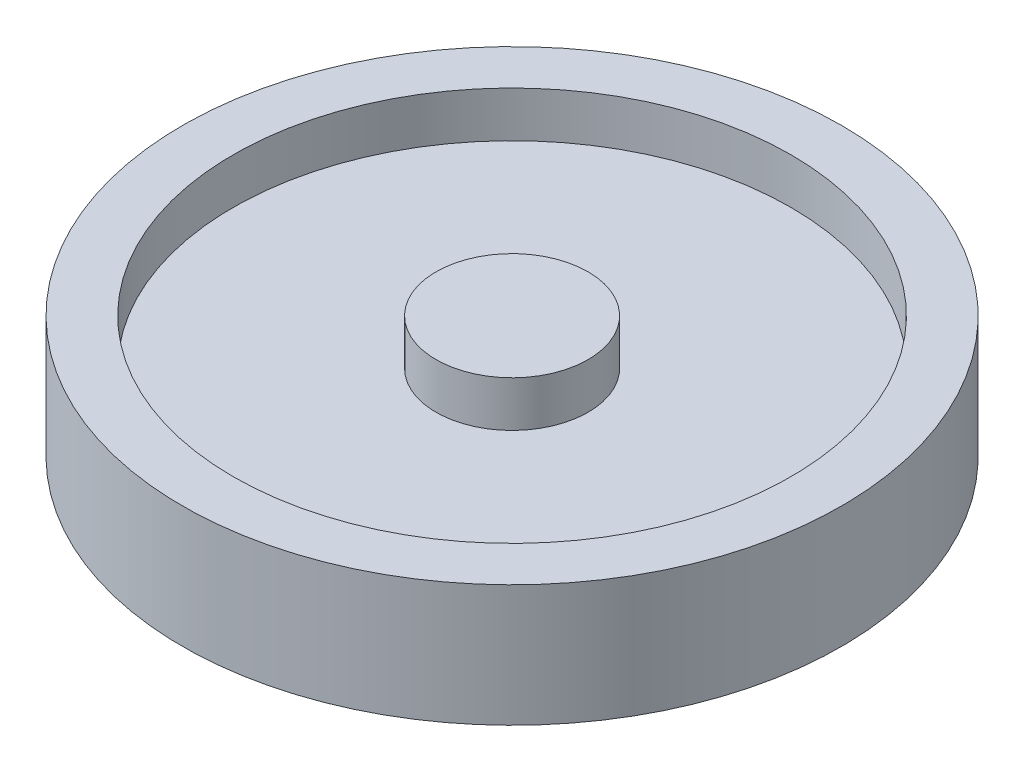
ISO-10303-21;
HEADER;
FILE_DESCRIPTION(('STEP AP214'),'2;1');
FILE_NAME('part.step','',(''),(''),'','','');
FILE_SCHEMA(('AUTOMOTIVE_DESIGN { 1 0 10303 214 1 1 1 1 }'));
ENDSEC;
DATA;
#1=APPLICATION_CONTEXT('core data for automotive mechanical design processes');
#2=APPLICATION_PROTOCOL_DEFINITION('international standard','automotive_design',2000,#1);
#3=PRODUCT_CONTEXT('',#1,'mechanical');
#4=PRODUCT('Part','Part','',(#3));
#5=PRODUCT_RELATED_PRODUCT_CATEGORY('part','',(#4));
#6=PRODUCT_DEFINITION_FORMATION('','',#4);
#7=PRODUCT_DEFINITION_CONTEXT('part definition',#1,'design');
#8=PRODUCT_DEFINITION('design','',#6,#7);
#9=PRODUCT_DEFINITION_SHAPE('','',#8);
#10=(LENGTH_UNIT() NAMED_UNIT(*) SI_UNIT(.MILLI.,.METRE.));
#11=(NAMED_UNIT(*) PLANE_ANGLE_UNIT() SI_UNIT($,.RADIAN.));
#12=(NAMED_UNIT(*) SI_UNIT($,.STERADIAN.) SOLID_ANGLE_UNIT());
#13=UNCERTAINTY_MEASURE_WITH_UNIT(LENGTH_MEASURE(1.E-05),#10,'distance_accuracy_value','');
#14=(GEOMETRIC_REPRESENTATION_CONTEXT(3) GLOBAL_UNCERTAINTY_ASSIGNED_CONTEXT((#13)) GLOBAL_UNIT_ASSIGNED_CONTEXT((#10,
#11,#12)) REPRESENTATION_CONTEXT('',''));
#15=CARTESIAN_POINT('',(0.,0.,0.));
#16=DIRECTION('',(0.,0.,1.));
#17=DIRECTION('',(1.,0.,0.));
#18=AXIS2_PLACEMENT_3D('',#15,#16,#17);
#19=CARTESIAN_POINT('',(0.,6.,0.));
#20=DIRECTION('',(0.,-1.,0.));
#21=DIRECTION('',(0.,0.,-1.));
#22=AXIS2_PLACEMENT_3D('',#19,#20,#21);
#23=PLANE('',#22);
#24=CARTESIAN_POINT('',(0.,6.,0.));
#25=DIRECTION('',(0.,-1.,0.));
#26=DIRECTION('',(0.,0.,-1.));
#27=AXIS2_PLACEMENT_3D('',#24,#25,#26);
#28=CIRCLE('',#27,7.5);
#29=CARTESIAN_POINT('',(0.,6.,-7.5));
#30=VERTEX_POINT('',#29);
#31=EDGE_CURVE('E10',#30,#30,#28,.T.);
#32=ORIENTED_EDGE('',*,*,#31,.F.);
#33=EDGE_LOOP('',(#32));
#34=FACE_BOUND('',#33,.T.);
#35=ADVANCED_FACE('F40',(#34),#23,.F.);
#36=CARTESIAN_POINT('',(0.,0.,0.));
#37=DIRECTION('',(0.,-1.,0.));
#38=DIRECTION('',(0.,0.,-1.));
#39=AXIS2_PLACEMENT_3D('',#36,#37,#38);
#40=CYLINDRICAL_SURFACE('',#39,7.5);
#41=CARTESIAN_POINT('',(0.,1.5,0.));
#42=DIRECTION('',(0.,-1.,0.));
#43=DIRECTION('',(0.,0.,-1.));
#44=AXIS2_PLACEMENT_3D('',#41,#42,#43);
#45=CIRCLE('',#44,7.5);
#46=CARTESIAN_POINT('',(0.,1.5,-7.5));
#47=VERTEX_POINT('',#46);
#48=EDGE_CURVE('E43',#47,#47,#45,.T.);
#49=ORIENTED_EDGE('',*,*,#48,.F.);
#50=EDGE_LOOP('',(#49));
#51=FACE_BOUND('',#50,.T.);
#52=ORIENTED_EDGE('',*,*,#31,.T.);
#53=EDGE_LOOP('',(#52));
#54=FACE_BOUND('',#53,.T.);
#55=ADVANCED_FACE('F122',(#51,#54),#40,.T.);
#56=CARTESIAN_POINT('',(0.,1.5,7.5));
#57=DIRECTION('',(0.,-1.,0.));
#58=DIRECTION('',(0.,0.,-1.));
#59=AXIS2_PLACEMENT_3D('',#56,#57,#58);
#60=PLANE('',#59);
#61=CARTESIAN_POINT('',(0.,1.5,0.));
#62=DIRECTION('',(0.,-1.,0.));
#63=DIRECTION('',(0.,0.,-1.));
#64=AXIS2_PLACEMENT_3D('',#61,#62,#63);
#65=CIRCLE('',#64,27.5);
#66=CARTESIAN_POINT('',(0.,1.5,-27.5));
#67=VERTEX_POINT('',#66);
#68=EDGE_CURVE('E50',#67,#67,#65,.T.);
#69=ORIENTED_EDGE('',*,*,#68,.F.);
#70=EDGE_LOOP('',(#69));
#71=FACE_BOUND('',#70,.T.);
#72=ORIENTED_EDGE('',*,*,#48,.T.);
#73=EDGE_LOOP('',(#72));
#74=FACE_BOUND('',#73,.T.);
#75=ADVANCED_FACE('F117',(#71,#74),#60,.F.);
#76=CARTESIAN_POINT('',(0.,0.,0.));
#77=DIRECTION('',(0.,-1.,0.));
#78=DIRECTION('',(0.,0.,-1.));
#79=AXIS2_PLACEMENT_3D('',#76,#77,#78);
#80=CYLINDRICAL_SURFACE('',#79,27.5);
#81=CARTESIAN_POINT('',(0.,6.,0.));
#82=DIRECTION('',(0.,-1.,0.));
#83=DIRECTION('',(0.,0.,-1.));
#84=AXIS2_PLACEMENT_3D('',#81,#82,#83);
#85=CIRCLE('',#84,27.5);
#86=CARTESIAN_POINT('',(0.,6.,-27.5));
#87=VERTEX_POINT('',#86);
#88=EDGE_CURVE('E51',#87,#87,#85,.T.);
#89=ORIENTED_EDGE('',*,*,#88,.F.);
#90=EDGE_LOOP('',(#89));
#91=FACE_BOUND('',#90,.T.);
#92=ORIENTED_EDGE('',*,*,#68,.T.);
#93=EDGE_LOOP('',(#92));
#94=FACE_BOUND('',#93,.T.);
#95=ADVANCED_FACE('F109',(#91,#94),#80,.F.);
#96=CARTESIAN_POINT('',(0.,6.,27.5));
#97=DIRECTION('',(0.,-1.,0.));
#98=DIRECTION('',(0.,0.,-1.));
#99=AXIS2_PLACEMENT_3D('',#96,#97,#98);
#100=PLANE('',#99);
#101=CARTESIAN_POINT('',(0.,6.,0.));
#102=DIRECTION('',(0.,-1.,0.));
#103=DIRECTION('',(0.,0.,-1.));
#104=AXIS2_PLACEMENT_3D('',#101,#102,#103);
#105=CIRCLE('',#104,32.5);
#106=CARTESIAN_POINT('',(0.,6.,-32.5));
#107=VERTEX_POINT('',#106);
#108=EDGE_CURVE('E57',#107,#107,#105,.T.);
#109=ORIENTED_EDGE('',*,*,#108,.F.);
#110=EDGE_LOOP('',(#109));
#111=FACE_BOUND('',#110,.T.);
#112=ORIENTED_EDGE('',*,*,#88,.T.);
#113=EDGE_LOOP('',(#112));
#114=FACE_BOUND('',#113,.T.);
#115=ADVANCED_FACE('F102',(#111,#114),#100,.F.);
#116=CARTESIAN_POINT('',(0.,0.,0.));
#117=DIRECTION('',(0.,-1.,0.));
#118=DIRECTION('',(0.,0.,-1.));
#119=AXIS2_PLACEMENT_3D('',#116,#117,#118);
#120=CYLINDRICAL_SURFACE('',#119,32.5);
#121=CARTESIAN_POINT('',(0.,-6.,0.));
#122=DIRECTION('',(0.,-1.,0.));
#123=DIRECTION('',(0.,0.,-1.));
#124=AXIS2_PLACEMENT_3D('',#121,#122,#123);
#125=CIRCLE('',#124,32.5);
#126=CARTESIAN_POINT('',(0.,-6.,-32.5));
#127=VERTEX_POINT('',#126);
#128=EDGE_CURVE('E56',#127,#127,#125,.T.);
#129=ORIENTED_EDGE('',*,*,#128,.F.);
#130=EDGE_LOOP('',(#129));
#131=FACE_BOUND('',#130,.T.);
#132=ORIENTED_EDGE('',*,*,#108,.T.);
#133=EDGE_LOOP('',(#132));
#134=FACE_BOUND('',#133,.T.);
#135=ADVANCED_FACE('F98',(#131,#134),#120,.T.);
#136=CARTESIAN_POINT('',(0.,-6.,32.5));
#137=DIRECTION('',(0.,1.,0.));
#138=DIRECTION('',(0.,0.,1.));
#139=AXIS2_PLACEMENT_3D('',#136,#137,#138);
#140=PLANE('',#139);
#141=CARTESIAN_POINT('',(0.,-6.,0.));
#142=DIRECTION('',(0.,-1.,0.));
#143=DIRECTION('',(0.,0.,-1.));
#144=AXIS2_PLACEMENT_3D('',#141,#142,#143);
#145=CIRCLE('',#144,27.5);
#146=CARTESIAN_POINT('',(0.,-6.,-27.5));
#147=VERTEX_POINT('',#146);
#148=EDGE_CURVE('E65',#147,#147,#145,.T.);
#149=ORIENTED_EDGE('',*,*,#148,.F.);
#150=EDGE_LOOP('',(#149));
#151=FACE_BOUND('',#150,.T.);
#152=ORIENTED_EDGE('',*,*,#128,.T.);
#153=EDGE_LOOP('',(#152));
#154=FACE_BOUND('',#153,.T.);
#155=ADVANCED_FACE('F95',(#151,#154),#140,.F.);
#156=CARTESIAN_POINT('',(0.,0.,0.));
#157=DIRECTION('',(0.,-1.,0.));
#158=DIRECTION('',(0.,0.,-1.));
#159=AXIS2_PLACEMENT_3D('',#156,#157,#158);
#160=CYLINDRICAL_SURFACE('',#159,27.5);
#161=CARTESIAN_POINT('',(0.,-1.5,0.));
#162=DIRECTION('',(0.,-1.,0.));
#163=DIRECTION('',(0.,0.,-1.));
#164=AXIS2_PLACEMENT_3D('',#161,#162,#163);
#165=CIRCLE('',#164,27.5);
#166=CARTESIAN_POINT('',(0.,-1.5,-27.5));
#167=VERTEX_POINT('',#166);
#168=EDGE_CURVE('E63',#167,#167,#165,.T.);
#169=ORIENTED_EDGE('',*,*,#168,.F.);
#170=EDGE_LOOP('',(#169));
#171=FACE_BOUND('',#170,.T.);
#172=ORIENTED_EDGE('',*,*,#148,.T.);
#173=EDGE_LOOP('',(#172));
#174=FACE_BOUND('',#173,.T.);
#175=ADVANCED_FACE('F88',(#171,#174),#160,.F.);
#176=CARTESIAN_POINT('',(0.,-1.5,27.5));
#177=DIRECTION('',(0.,1.,0.));
#178=DIRECTION('',(0.,0.,1.));
#179=AXIS2_PLACEMENT_3D('',#176,#177,#178);
#180=PLANE('',#179);
#181=CARTESIAN_POINT('',(0.,-1.5,0.));
#182=DIRECTION('',(0.,-1.,0.));
#183=DIRECTION('',(0.,0.,-1.));
#184=AXIS2_PLACEMENT_3D('',#181,#182,#183);
#185=CIRCLE('',#184,7.5);
#186=CARTESIAN_POINT('',(0.,-1.5,-7.5));
#187=VERTEX_POINT('',#186);
#188=EDGE_CURVE('E69',#187,#187,#185,.T.);
#189=ORIENTED_EDGE('',*,*,#188,.F.);
#190=EDGE_LOOP('',(#189));
#191=FACE_BOUND('',#190,.T.);
#192=ORIENTED_EDGE('',*,*,#168,.T.);
#193=EDGE_LOOP('',(#192));
#194=FACE_BOUND('',#193,.T.);
#195=ADVANCED_FACE('F78',(#191,#194),#180,.F.);
#196=CARTESIAN_POINT('',(0.,0.,0.));
#197=DIRECTION('',(0.,-1.,0.));
#198=DIRECTION('',(0.,0.,-1.));
#199=AXIS2_PLACEMENT_3D('',#196,#197,#198);
#200=CYLINDRICAL_SURFACE('',#199,7.5);
#201=CARTESIAN_POINT('',(0.,-8.,0.));
#202=DIRECTION('',(0.,-1.,0.));
#203=DIRECTION('',(0.,0.,-1.));
#204=AXIS2_PLACEMENT_3D('',#201,#202,#203);
#205=CIRCLE('',#204,7.5);
#206=CARTESIAN_POINT('',(0.,-8.,-7.5));
#207=VERTEX_POINT('',#206);
#208=EDGE_CURVE('E72',#207,#207,#205,.T.);
#209=ORIENTED_EDGE('',*,*,#208,.F.);
#210=EDGE_LOOP('',(#209));
#211=FACE_BOUND('',#210,.T.);
#212=ORIENTED_EDGE('',*,*,#188,.T.);
#213=EDGE_LOOP('',(#212));
#214=FACE_BOUND('',#213,.T.);
#215=ADVANCED_FACE('F80',(#211,#214),#200,.T.);
#216=CARTESIAN_POINT('',(0.,-8.,7.5));
#217=DIRECTION('',(0.,1.,0.));
#218=DIRECTION('',(0.,0.,1.));
#219=AXIS2_PLACEMENT_3D('',#216,#217,#218);
#220=PLANE('',#219);
#221=ORIENTED_EDGE('',*,*,#208,.T.);
#222=EDGE_LOOP('',(#221));
#223=FACE_BOUND('',#222,.T.);
#224=ADVANCED_FACE('F73',(#223),#220,.F.);
#225=CLOSED_SHELL('',(#35,#55,#75,#95,#115,#135,#155,#175,#195,#215,#224));
#226=MANIFOLD_SOLID_BREP('B2',#225);
#227=ADVANCED_BREP_SHAPE_REPRESENTATION('',(#18,#226),#14);
#228=SHAPE_DEFINITION_REPRESENTATION(#9,#227);
ENDSEC;
END-ISO-10303-21;
